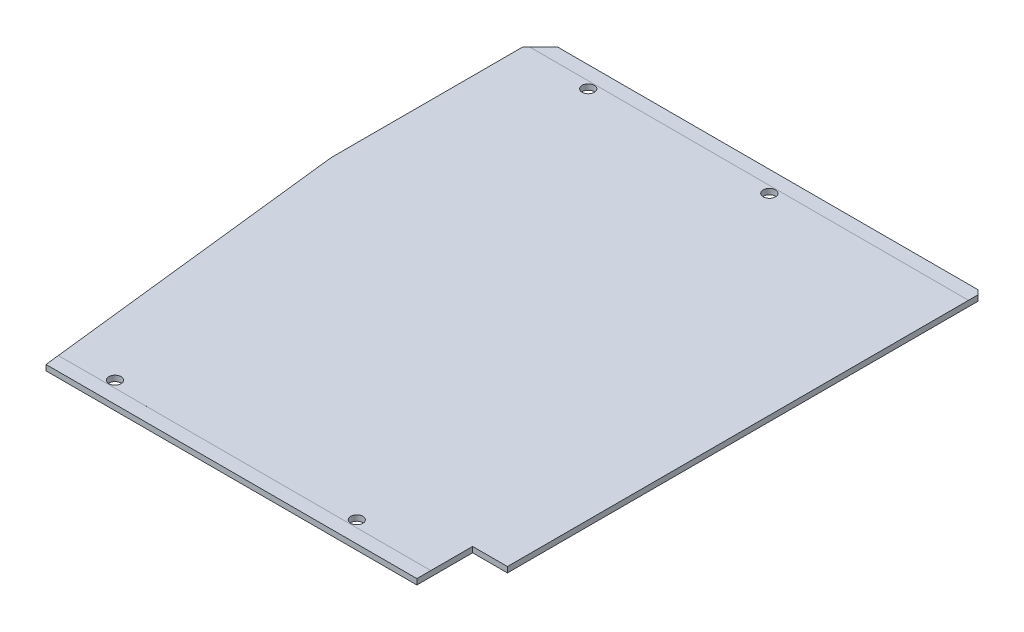
ISO-10303-21;
HEADER;
FILE_DESCRIPTION(('STEP AP214'),'2;1');
FILE_NAME('part.step','',(''),(''),'','','');
FILE_SCHEMA(('AUTOMOTIVE_DESIGN { 1 0 10303 214 1 1 1 1 }'));
ENDSEC;
DATA;
#1=APPLICATION_CONTEXT('core data for automotive mechanical design processes');
#2=APPLICATION_PROTOCOL_DEFINITION('international standard','automotive_design',2000,#1);
#3=PRODUCT_CONTEXT('',#1,'mechanical');
#4=PRODUCT('Part','Part','',(#3));
#5=PRODUCT_RELATED_PRODUCT_CATEGORY('part','',(#4));
#6=PRODUCT_DEFINITION_FORMATION('','',#4);
#7=PRODUCT_DEFINITION_CONTEXT('part definition',#1,'design');
#8=PRODUCT_DEFINITION('design','',#6,#7);
#9=PRODUCT_DEFINITION_SHAPE('','',#8);
#10=(LENGTH_UNIT() NAMED_UNIT(*) SI_UNIT(.MILLI.,.METRE.));
#11=(NAMED_UNIT(*) PLANE_ANGLE_UNIT() SI_UNIT($,.RADIAN.));
#12=(NAMED_UNIT(*) SI_UNIT($,.STERADIAN.) SOLID_ANGLE_UNIT());
#13=UNCERTAINTY_MEASURE_WITH_UNIT(LENGTH_MEASURE(1.E-05),#10,'distance_accuracy_value','');
#14=(GEOMETRIC_REPRESENTATION_CONTEXT(3) GLOBAL_UNCERTAINTY_ASSIGNED_CONTEXT((#13)) GLOBAL_UNIT_ASSIGNED_CONTEXT((#10,
#11,#12)) REPRESENTATION_CONTEXT('',''));
#15=CARTESIAN_POINT('',(0.,0.,0.));
#16=DIRECTION('',(0.,0.,1.));
#17=DIRECTION('',(1.,0.,0.));
#18=AXIS2_PLACEMENT_3D('',#15,#16,#17);
#19=CARTESIAN_POINT('',(-63.5,1.6,76.2));
#20=DIRECTION('',(0.,0.,-1.));
#21=DIRECTION('',(-1.,0.,0.));
#22=AXIS2_PLACEMENT_3D('',#19,#20,#21);
#23=PLANE('',#22);
#24=DIRECTION('',(1.,0.,0.));
#25=VECTOR('',#24,1.);
#26=CARTESIAN_POINT('',(-63.5,0.,76.2));
#27=LINE('',#26,#25);
#28=CARTESIAN_POINT('',(-53.,0.,76.2));
#29=VERTEX_POINT('',#28);
#30=CARTESIAN_POINT('',(53.5,0.,76.2));
#31=VERTEX_POINT('',#30);
#32=EDGE_CURVE('E148',#29,#31,#27,.T.);
#33=ORIENTED_EDGE('',*,*,#32,.T.);
#34=DIRECTION('',(0.,1.,0.));
#35=VECTOR('',#34,1.);
#36=CARTESIAN_POINT('',(53.5,-8.4,76.2));
#37=LINE('',#36,#35);
#38=CARTESIAN_POINT('',(53.5,1.5999,76.2));
#39=VERTEX_POINT('',#38);
#40=EDGE_CURVE('E133',#31,#39,#37,.T.);
#41=ORIENTED_EDGE('',*,*,#40,.T.);
#42=DIRECTION('',(1.,0.,0.));
#43=VECTOR('',#42,1.);
#44=CARTESIAN_POINT('',(-63.5,1.5999,76.2));
#45=LINE('',#44,#43);
#46=CARTESIAN_POINT('',(-53.,1.5999,76.2));
#47=VERTEX_POINT('',#46);
#48=EDGE_CURVE('E194',#47,#39,#45,.T.);
#49=ORIENTED_EDGE('',*,*,#48,.F.);
#50=DIRECTION('',(0.,-1.,0.));
#51=VECTOR('',#50,1.);
#52=CARTESIAN_POINT('',(-53.,249.583617394151,76.2));
#53=LINE('',#52,#51);
#54=EDGE_CURVE('E54',#47,#29,#53,.T.);
#55=ORIENTED_EDGE('',*,*,#54,.T.);
#56=EDGE_LOOP('',(#33,#41,#49,#55));
#57=FACE_BOUND('',#56,.T.);
#58=ADVANCED_FACE('F31',(#57),#23,.F.);
#59=CARTESIAN_POINT('',(63.5,1.6,76.2));
#60=DIRECTION('',(0.,1.,0.));
#61=DIRECTION('',(0.,0.,1.));
#62=AXIS2_PLACEMENT_3D('',#59,#60,#61);
#63=PLANE('',#62);
#64=CARTESIAN_POINT('',(-39.188,1.6,70.2));
#65=DIRECTION('',(0.,1.,0.));
#66=DIRECTION('',(0.,0.,1.));
#67=AXIS2_PLACEMENT_3D('',#64,#65,#66);
#68=CIRCLE('',#67,1.75);
#69=CARTESIAN_POINT('',(-39.188,1.6,71.95));
#70=VERTEX_POINT('',#69);
#71=EDGE_CURVE('E257',#70,#70,#68,.T.);
#72=ORIENTED_EDGE('',*,*,#71,.F.);
#73=EDGE_LOOP('',(#72));
#74=FACE_BOUND('',#73,.T.);
#75=CARTESIAN_POINT('',(30.252,1.6,70.2));
#76=DIRECTION('',(0.,1.,0.));
#77=DIRECTION('',(0.,0.,1.));
#78=AXIS2_PLACEMENT_3D('',#75,#76,#77);
#79=CIRCLE('',#78,1.75);
#80=CARTESIAN_POINT('',(30.252,1.6,71.95));
#81=VERTEX_POINT('',#80);
#82=EDGE_CURVE('E251',#81,#81,#79,.T.);
#83=ORIENTED_EDGE('',*,*,#82,.F.);
#84=EDGE_LOOP('',(#83));
#85=FACE_BOUND('',#84,.T.);
#86=CARTESIAN_POINT('',(8.29999999999998,1.6,-70.2));
#87=DIRECTION('',(0.,1.,0.));
#88=DIRECTION('',(0.,0.,1.));
#89=AXIS2_PLACEMENT_3D('',#86,#87,#88);
#90=CIRCLE('',#89,1.75);
#91=CARTESIAN_POINT('',(8.29999999999998,1.6,-68.45));
#92=VERTEX_POINT('',#91);
#93=EDGE_CURVE('E245',#92,#92,#90,.T.);
#94=ORIENTED_EDGE('',*,*,#93,.F.);
#95=EDGE_LOOP('',(#94));
#96=FACE_BOUND('',#95,.T.);
#97=CARTESIAN_POINT('',(-43.7,1.6,-70.2));
#98=DIRECTION('',(0.,1.,0.));
#99=DIRECTION('',(0.,0.,1.));
#100=AXIS2_PLACEMENT_3D('',#97,#98,#99);
#101=CIRCLE('',#100,1.75);
#102=CARTESIAN_POINT('',(-43.7,1.6,-68.45));
#103=VERTEX_POINT('',#102);
#104=EDGE_CURVE('E239',#103,#103,#101,.T.);
#105=ORIENTED_EDGE('',*,*,#104,.F.);
#106=EDGE_LOOP('',(#105));
#107=FACE_BOUND('',#106,.T.);
#108=DIRECTION('',(0.,0.,1.));
#109=VECTOR('',#108,1.);
#110=CARTESIAN_POINT('',(53.5,1.6,76.2));
#111=LINE('',#110,#109);
#112=CARTESIAN_POINT('',(53.5,1.6,60.2));
#113=VERTEX_POINT('',#112);
#114=CARTESIAN_POINT('',(53.5,1.6,72.2));
#115=VERTEX_POINT('',#114);
#116=EDGE_CURVE('E141',#113,#115,#111,.T.);
#117=ORIENTED_EDGE('',*,*,#116,.F.);
#118=DIRECTION('',(-1.,0.,0.));
#119=VECTOR('',#118,1.);
#120=CARTESIAN_POINT('',(53.5,1.6,60.2));
#121=LINE('',#120,#119);
#122=CARTESIAN_POINT('',(63.5,1.6,60.2));
#123=VERTEX_POINT('',#122);
#124=EDGE_CURVE('E127',#123,#113,#121,.T.);
#125=ORIENTED_EDGE('',*,*,#124,.F.);
#126=DIRECTION('',(0.,0.,-1.));
#127=VECTOR('',#126,1.);
#128=CARTESIAN_POINT('',(63.5,1.6,-76.2));
#129=LINE('',#128,#127);
#130=CARTESIAN_POINT('',(63.5,1.6,-72.2));
#131=VERTEX_POINT('',#130);
#132=EDGE_CURVE('E138',#123,#131,#129,.T.);
#133=ORIENTED_EDGE('',*,*,#132,.T.);
#134=DIRECTION('',(-1.,0.,0.));
#135=VECTOR('',#134,1.);
#136=CARTESIAN_POINT('',(72.4805203195643,1.6,-72.2));
#137=LINE('',#136,#135);
#138=CARTESIAN_POINT('',(-62.5,1.6,-72.2));
#139=VERTEX_POINT('',#138);
#140=EDGE_CURVE('E212',#131,#139,#137,.T.);
#141=ORIENTED_EDGE('',*,*,#140,.T.);
#142=DIRECTION('',(0.707106781186548,0.,-0.707106781186548));
#143=VECTOR('',#142,1.);
#144=CARTESIAN_POINT('',(-73.7,1.6,-61.));
#145=LINE('',#144,#143);
#146=CARTESIAN_POINT('',(-63.5,1.6,-71.2));
#147=VERTEX_POINT('',#146);
#148=EDGE_CURVE('E173',#139,#147,#145,.F.);
#149=ORIENTED_EDGE('',*,*,#148,.T.);
#150=DIRECTION('',(0.,0.,1.));
#151=VECTOR('',#150,1.);
#152=CARTESIAN_POINT('',(-63.5,1.6,-76.2));
#153=LINE('',#152,#151);
#154=CARTESIAN_POINT('',(-63.5,1.59999999999999,-16.2));
#155=VERTEX_POINT('',#154);
#156=EDGE_CURVE('E147',#147,#155,#153,.T.);
#157=ORIENTED_EDGE('',*,*,#156,.T.);
#158=DIRECTION('',(0.112909688044286,0.,0.993605254789719));
#159=VECTOR('',#158,1.);
#160=CARTESIAN_POINT('',(-51.514788373279,1.6,89.2698623151453));
#161=LINE('',#160,#159);
#162=CARTESIAN_POINT('',(-53.4545454545454,1.6,72.2));
#163=VERTEX_POINT('',#162);
#164=EDGE_CURVE('E219',#155,#163,#161,.T.);
#165=ORIENTED_EDGE('',*,*,#164,.T.);
#166=DIRECTION('',(1.,0.,0.));
#167=VECTOR('',#166,1.);
#168=CARTESIAN_POINT('',(72.4805203195644,1.6,72.2));
#169=LINE('',#168,#167);
#170=EDGE_CURVE('E209',#163,#115,#169,.T.);
#171=ORIENTED_EDGE('',*,*,#170,.T.);
#172=EDGE_LOOP('',(#117,#125,#133,#141,#149,#157,#165,#171));
#173=FACE_BOUND('',#172,.T.);
#174=ADVANCED_FACE('F136',(#74,#85,#96,#107,#173),#63,.T.);
#175=CARTESIAN_POINT('',(-63.5,1.6,-76.2));
#176=DIRECTION('',(1.,0.,0.));
#177=DIRECTION('',(0.,0.,-1.));
#178=AXIS2_PLACEMENT_3D('',#175,#176,#177);
#179=PLANE('',#178);
#180=DIRECTION('',(0.,-1.,0.));
#181=VECTOR('',#180,1.);
#182=CARTESIAN_POINT('',(-63.5,249.583617394151,-16.2));
#183=LINE('',#182,#181);
#184=CARTESIAN_POINT('',(-63.5,0.,-16.2));
#185=VERTEX_POINT('',#184);
#186=EDGE_CURVE('E224',#155,#185,#183,.T.);
#187=ORIENTED_EDGE('',*,*,#186,.F.);
#188=ORIENTED_EDGE('',*,*,#156,.F.);
#189=DIRECTION('',(0.,-1.,0.));
#190=VECTOR('',#189,1.);
#191=CARTESIAN_POINT('',(-63.5,1.6,-71.2));
#192=LINE('',#191,#190);
#193=CARTESIAN_POINT('',(-63.5,0.,-71.2));
#194=VERTEX_POINT('',#193);
#195=EDGE_CURVE('E151',#147,#194,#192,.T.);
#196=ORIENTED_EDGE('',*,*,#195,.T.);
#197=DIRECTION('',(0.,0.,1.));
#198=VECTOR('',#197,1.);
#199=CARTESIAN_POINT('',(-63.5,0.,-76.2));
#200=LINE('',#199,#198);
#201=EDGE_CURVE('E154',#194,#185,#200,.T.);
#202=ORIENTED_EDGE('',*,*,#201,.T.);
#203=EDGE_LOOP('',(#187,#188,#196,#202));
#204=FACE_BOUND('',#203,.T.);
#205=ADVANCED_FACE('F266',(#204),#179,.F.);
#206=CARTESIAN_POINT('',(63.5,0.,76.2));
#207=DIRECTION('',(0.,1.,0.));
#208=DIRECTION('',(0.,0.,1.));
#209=AXIS2_PLACEMENT_3D('',#206,#207,#208);
#210=PLANE('',#209);
#211=CARTESIAN_POINT('',(-39.188,0.,70.2));
#212=DIRECTION('',(0.,1.,0.));
#213=DIRECTION('',(0.,0.,1.));
#214=AXIS2_PLACEMENT_3D('',#211,#212,#213);
#215=CIRCLE('',#214,1.75);
#216=CARTESIAN_POINT('',(-39.188,0.,71.95));
#217=VERTEX_POINT('',#216);
#218=EDGE_CURVE('E254',#217,#217,#215,.F.);
#219=ORIENTED_EDGE('',*,*,#218,.F.);
#220=EDGE_LOOP('',(#219));
#221=FACE_BOUND('',#220,.T.);
#222=CARTESIAN_POINT('',(30.252,0.,70.2));
#223=DIRECTION('',(0.,1.,0.));
#224=DIRECTION('',(0.,0.,1.));
#225=AXIS2_PLACEMENT_3D('',#222,#223,#224);
#226=CIRCLE('',#225,1.75);
#227=CARTESIAN_POINT('',(30.252,0.,71.95));
#228=VERTEX_POINT('',#227);
#229=EDGE_CURVE('E248',#228,#228,#226,.F.);
#230=ORIENTED_EDGE('',*,*,#229,.F.);
#231=EDGE_LOOP('',(#230));
#232=FACE_BOUND('',#231,.T.);
#233=CARTESIAN_POINT('',(8.29999999999998,0.,-70.2));
#234=DIRECTION('',(0.,1.,0.));
#235=DIRECTION('',(0.,0.,1.));
#236=AXIS2_PLACEMENT_3D('',#233,#234,#235);
#237=CIRCLE('',#236,1.75);
#238=CARTESIAN_POINT('',(8.29999999999998,0.,-68.45));
#239=VERTEX_POINT('',#238);
#240=EDGE_CURVE('E242',#239,#239,#237,.F.);
#241=ORIENTED_EDGE('',*,*,#240,.F.);
#242=EDGE_LOOP('',(#241));
#243=FACE_BOUND('',#242,.T.);
#244=CARTESIAN_POINT('',(-43.7,0.,-70.2));
#245=DIRECTION('',(0.,1.,0.));
#246=DIRECTION('',(0.,0.,1.));
#247=AXIS2_PLACEMENT_3D('',#244,#245,#246);
#248=CIRCLE('',#247,1.75);
#249=CARTESIAN_POINT('',(-43.7,0.,-68.45));
#250=VERTEX_POINT('',#249);
#251=EDGE_CURVE('E236',#250,#250,#248,.F.);
#252=ORIENTED_EDGE('',*,*,#251,.F.);
#253=EDGE_LOOP('',(#252));
#254=FACE_BOUND('',#253,.T.);
#255=DIRECTION('',(-1.,0.,0.));
#256=VECTOR('',#255,1.);
#257=CARTESIAN_POINT('',(63.5,0.,60.2));
#258=LINE('',#257,#256);
#259=CARTESIAN_POINT('',(63.5,0.,60.2));
#260=VERTEX_POINT('',#259);
#261=CARTESIAN_POINT('',(53.5,0.,60.2));
#262=VERTEX_POINT('',#261);
#263=EDGE_CURVE('E46',#260,#262,#258,.T.);
#264=ORIENTED_EDGE('',*,*,#263,.T.);
#265=DIRECTION('',(0.,0.,1.));
#266=VECTOR('',#265,1.);
#267=CARTESIAN_POINT('',(53.5,0.,76.2));
#268=LINE('',#267,#266);
#269=EDGE_CURVE('E226',#262,#31,#268,.T.);
#270=ORIENTED_EDGE('',*,*,#269,.T.);
#271=ORIENTED_EDGE('',*,*,#32,.F.);
#272=DIRECTION('',(0.112909688044286,0.,0.993605254789719));
#273=VECTOR('',#272,1.);
#274=CARTESIAN_POINT('',(-51.514788373279,0.,89.2698623151453));
#275=LINE('',#274,#273);
#276=EDGE_CURVE('E214',#185,#29,#275,.T.);
#277=ORIENTED_EDGE('',*,*,#276,.F.);
#278=ORIENTED_EDGE('',*,*,#201,.F.);
#279=DIRECTION('',(-0.707106781186548,0.,0.707106781186548));
#280=VECTOR('',#279,1.);
#281=CARTESIAN_POINT('',(-63.5,0.,-71.2));
#282=LINE('',#281,#280);
#283=CARTESIAN_POINT('',(-58.5,0.,-76.2));
#284=VERTEX_POINT('',#283);
#285=EDGE_CURVE('E167',#194,#284,#282,.F.);
#286=ORIENTED_EDGE('',*,*,#285,.T.);
#287=DIRECTION('',(-1.,0.,0.));
#288=VECTOR('',#287,1.);
#289=CARTESIAN_POINT('',(-63.5,0.,-76.2));
#290=LINE('',#289,#288);
#291=CARTESIAN_POINT('',(62.23,0.,-76.2));
#292=VERTEX_POINT('',#291);
#293=EDGE_CURVE('E161',#292,#284,#290,.T.);
#294=ORIENTED_EDGE('',*,*,#293,.F.);
#295=DIRECTION('',(-0.70710678118654,0.,-0.707106781186555));
#296=VECTOR('',#295,1.);
#297=CARTESIAN_POINT('',(62.23,0.,-76.2));
#298=LINE('',#297,#296);
#299=CARTESIAN_POINT('',(63.5,0.,-74.93));
#300=VERTEX_POINT('',#299);
#301=EDGE_CURVE('E178',#292,#300,#298,.F.);
#302=ORIENTED_EDGE('',*,*,#301,.T.);
#303=DIRECTION('',(0.,0.,-1.));
#304=VECTOR('',#303,1.);
#305=CARTESIAN_POINT('',(63.5,0.,-76.2));
#306=LINE('',#305,#304);
#307=EDGE_CURVE('E159',#260,#300,#306,.T.);
#308=ORIENTED_EDGE('',*,*,#307,.F.);
#309=EDGE_LOOP('',(#264,#270,#271,#277,#278,#286,#294,#302,#308));
#310=FACE_BOUND('',#309,.T.);
#311=ADVANCED_FACE('F281',(#221,#232,#243,#254,#310),#210,.F.);
#312=CARTESIAN_POINT('',(72.4805203195644,1.5999,72.2));
#313=DIRECTION('',(0.,0.,1.));
#314=DIRECTION('',(1.,0.,0.));
#315=AXIS2_PLACEMENT_3D('',#312,#313,#314);
#316=PLANE('',#315);
#317=DIRECTION('',(0.,-1.,0.));
#318=VECTOR('',#317,1.);
#319=CARTESIAN_POINT('',(53.5,1.5999,72.2));
#320=LINE('',#319,#318);
#321=CARTESIAN_POINT('',(53.5,1.5999,72.2));
#322=VERTEX_POINT('',#321);
#323=EDGE_CURVE('E230',#115,#322,#320,.T.);
#324=ORIENTED_EDGE('',*,*,#323,.F.);
#325=ORIENTED_EDGE('',*,*,#170,.F.);
#326=DIRECTION('',(0.,-1.,0.));
#327=VECTOR('',#326,1.);
#328=CARTESIAN_POINT('',(-53.4545454545454,1.5999,72.2));
#329=LINE('',#328,#327);
#330=CARTESIAN_POINT('',(-53.4545454545455,1.5999,72.2));
#331=VERTEX_POINT('',#330);
#332=EDGE_CURVE('E222',#163,#331,#329,.T.);
#333=ORIENTED_EDGE('',*,*,#332,.T.);
#334=DIRECTION('',(1.,0.,0.));
#335=VECTOR('',#334,1.);
#336=CARTESIAN_POINT('',(72.4805203195644,1.5999,72.2));
#337=LINE('',#336,#335);
#338=EDGE_CURVE('E196',#331,#322,#337,.T.);
#339=ORIENTED_EDGE('',*,*,#338,.T.);
#340=EDGE_LOOP('',(#324,#325,#333,#339));
#341=FACE_BOUND('',#340,.T.);
#342=ADVANCED_FACE('F284',(#341),#316,.T.);
#343=CARTESIAN_POINT('',(-0.842207065483019,1.5999,0.));
#344=DIRECTION('',(0.,1.,0.));
#345=DIRECTION('',(0.,0.,1.));
#346=AXIS2_PLACEMENT_3D('',#343,#344,#345);
#347=PLANE('',#346);
#348=DIRECTION('',(0.,0.,1.));
#349=VECTOR('',#348,1.);
#350=CARTESIAN_POINT('',(53.5,1.5999,0.));
#351=LINE('',#350,#349);
#352=EDGE_CURVE('E12',#322,#39,#351,.T.);
#353=ORIENTED_EDGE('',*,*,#352,.F.);
#354=ORIENTED_EDGE('',*,*,#338,.F.);
#355=DIRECTION('',(0.112909688044286,0.,0.993605254789719));
#356=VECTOR('',#355,1.);
#357=CARTESIAN_POINT('',(-60.883760926383,1.5999,6.82290384782955));
#358=LINE('',#357,#356);
#359=EDGE_CURVE('E39',#331,#47,#358,.T.);
#360=ORIENTED_EDGE('',*,*,#359,.T.);
#361=ORIENTED_EDGE('',*,*,#48,.T.);
#362=EDGE_LOOP('',(#353,#354,#360,#361));
#363=FACE_BOUND('',#362,.T.);
#364=ADVANCED_FACE('F193',(#363),#347,.T.);
#365=CARTESIAN_POINT('',(63.5,1.6,-76.2));
#366=DIRECTION('',(-1.,0.,0.));
#367=DIRECTION('',(0.,0.,1.));
#368=AXIS2_PLACEMENT_3D('',#365,#366,#367);
#369=PLANE('',#368);
#370=ORIENTED_EDGE('',*,*,#132,.F.);
#371=DIRECTION('',(0.,1.,0.));
#372=VECTOR('',#371,1.);
#373=CARTESIAN_POINT('',(63.5,-8.4,60.2));
#374=LINE('',#373,#372);
#375=EDGE_CURVE('E124',#260,#123,#374,.T.);
#376=ORIENTED_EDGE('',*,*,#375,.F.);
#377=ORIENTED_EDGE('',*,*,#307,.T.);
#378=DIRECTION('',(0.,1.,0.));
#379=VECTOR('',#378,1.);
#380=CARTESIAN_POINT('',(63.5,1.6,-74.93));
#381=LINE('',#380,#379);
#382=CARTESIAN_POINT('',(63.5,1.5999,-74.93));
#383=VERTEX_POINT('',#382);
#384=EDGE_CURVE('E175',#300,#383,#381,.T.);
#385=ORIENTED_EDGE('',*,*,#384,.T.);
#386=DIRECTION('',(0.,0.,-1.));
#387=VECTOR('',#386,1.);
#388=CARTESIAN_POINT('',(63.5,1.5999,-76.2));
#389=LINE('',#388,#387);
#390=CARTESIAN_POINT('',(63.5,1.5999,-72.2));
#391=VERTEX_POINT('',#390);
#392=EDGE_CURVE('E203',#391,#383,#389,.T.);
#393=ORIENTED_EDGE('',*,*,#392,.F.);
#394=DIRECTION('',(0.,-1.,0.));
#395=VECTOR('',#394,1.);
#396=CARTESIAN_POINT('',(63.5,1.6,-72.2));
#397=LINE('',#396,#395);
#398=EDGE_CURVE('E146',#131,#391,#397,.T.);
#399=ORIENTED_EDGE('',*,*,#398,.F.);
#400=EDGE_LOOP('',(#370,#376,#377,#385,#393,#399));
#401=FACE_BOUND('',#400,.T.);
#402=ADVANCED_FACE('F144',(#401),#369,.F.);
#403=CARTESIAN_POINT('',(-63.5,1.6,-76.2));
#404=DIRECTION('',(0.,0.,1.));
#405=DIRECTION('',(1.,0.,0.));
#406=AXIS2_PLACEMENT_3D('',#403,#404,#405);
#407=PLANE('',#406);
#408=DIRECTION('',(-1.,0.,0.));
#409=VECTOR('',#408,1.);
#410=CARTESIAN_POINT('',(-63.5,1.5999,-76.2));
#411=LINE('',#410,#409);
#412=CARTESIAN_POINT('',(62.23,1.5999,-76.2));
#413=VERTEX_POINT('',#412);
#414=CARTESIAN_POINT('',(-58.5,1.5999,-76.2));
#415=VERTEX_POINT('',#414);
#416=EDGE_CURVE('E207',#413,#415,#411,.T.);
#417=ORIENTED_EDGE('',*,*,#416,.F.);
#418=DIRECTION('',(0.,-1.,0.));
#419=VECTOR('',#418,1.);
#420=CARTESIAN_POINT('',(62.23,1.6,-76.2));
#421=LINE('',#420,#419);
#422=EDGE_CURVE('E181',#413,#292,#421,.T.);
#423=ORIENTED_EDGE('',*,*,#422,.T.);
#424=ORIENTED_EDGE('',*,*,#293,.T.);
#425=DIRECTION('',(0.,1.,0.));
#426=VECTOR('',#425,1.);
#427=CARTESIAN_POINT('',(-58.5,1.6,-76.2));
#428=LINE('',#427,#426);
#429=EDGE_CURVE('E170',#284,#415,#428,.T.);
#430=ORIENTED_EDGE('',*,*,#429,.T.);
#431=EDGE_LOOP('',(#417,#423,#424,#430));
#432=FACE_BOUND('',#431,.T.);
#433=ADVANCED_FACE('F297',(#432),#407,.F.);
#434=CARTESIAN_POINT('',(-63.5,1.6,-71.2));
#435=DIRECTION('',(0.707106781186548,0.,0.707106781186548));
#436=DIRECTION('',(0.707106781186548,0.,-0.707106781186548));
#437=AXIS2_PLACEMENT_3D('',#434,#435,#436);
#438=PLANE('',#437);
#439=DIRECTION('',(0.,1.,0.));
#440=VECTOR('',#439,1.);
#441=CARTESIAN_POINT('',(-62.5,1.6,-72.2));
#442=LINE('',#441,#440);
#443=CARTESIAN_POINT('',(-62.5,1.5999,-72.2));
#444=VERTEX_POINT('',#443);
#445=EDGE_CURVE('E186',#139,#444,#442,.F.);
#446=ORIENTED_EDGE('',*,*,#445,.T.);
#447=DIRECTION('',(-0.707106781186548,0.,0.707106781186548));
#448=VECTOR('',#447,1.);
#449=CARTESIAN_POINT('',(-63.5,1.5999,-71.2));
#450=LINE('',#449,#448);
#451=EDGE_CURVE('E201',#444,#415,#450,.F.);
#452=ORIENTED_EDGE('',*,*,#451,.T.);
#453=ORIENTED_EDGE('',*,*,#429,.F.);
#454=ORIENTED_EDGE('',*,*,#285,.F.);
#455=ORIENTED_EDGE('',*,*,#195,.F.);
#456=ORIENTED_EDGE('',*,*,#148,.F.);
#457=EDGE_LOOP('',(#446,#452,#453,#454,#455,#456));
#458=FACE_BOUND('',#457,.T.);
#459=ADVANCED_FACE('F300',(#458),#438,.F.);
#460=CARTESIAN_POINT('',(62.23,1.6,-76.2));
#461=DIRECTION('',(-0.707106781186555,0.,0.70710678118654));
#462=DIRECTION('',(0.70710678118654,0.,0.707106781186555));
#463=AXIS2_PLACEMENT_3D('',#460,#461,#462);
#464=PLANE('',#463);
#465=ORIENTED_EDGE('',*,*,#422,.F.);
#466=DIRECTION('',(-0.70710678118654,0.,-0.707106781186555));
#467=VECTOR('',#466,1.);
#468=CARTESIAN_POINT('',(62.23,1.5999,-76.2));
#469=LINE('',#468,#467);
#470=EDGE_CURVE('E183',#413,#383,#469,.F.);
#471=ORIENTED_EDGE('',*,*,#470,.T.);
#472=ORIENTED_EDGE('',*,*,#384,.F.);
#473=ORIENTED_EDGE('',*,*,#301,.F.);
#474=EDGE_LOOP('',(#465,#471,#472,#473));
#475=FACE_BOUND('',#474,.T.);
#476=ADVANCED_FACE('F33',(#475),#464,.F.);
#477=DIRECTION('',(-1.,0.,0.));
#478=VECTOR('',#477,1.);
#479=CARTESIAN_POINT('',(72.4805203195643,1.5999,-72.2));
#480=LINE('',#479,#478);
#481=EDGE_CURVE('E211',#391,#444,#480,.T.);
#482=ORIENTED_EDGE('',*,*,#481,.F.);
#483=ORIENTED_EDGE('',*,*,#392,.T.);
#484=ORIENTED_EDGE('',*,*,#470,.F.);
#485=ORIENTED_EDGE('',*,*,#416,.T.);
#486=ORIENTED_EDGE('',*,*,#451,.F.);
#487=EDGE_LOOP('',(#482,#483,#484,#485,#486));
#488=FACE_BOUND('',#487,.T.);
#489=ADVANCED_FACE('F295',(#488),#347,.T.);
#490=CARTESIAN_POINT('',(72.4805203195643,1.5999,-72.2));
#491=DIRECTION('',(0.,0.,-1.));
#492=DIRECTION('',(-1.,0.,0.));
#493=AXIS2_PLACEMENT_3D('',#490,#491,#492);
#494=PLANE('',#493);
#495=ORIENTED_EDGE('',*,*,#398,.T.);
#496=ORIENTED_EDGE('',*,*,#481,.T.);
#497=ORIENTED_EDGE('',*,*,#445,.F.);
#498=ORIENTED_EDGE('',*,*,#140,.F.);
#499=EDGE_LOOP('',(#495,#496,#497,#498));
#500=FACE_BOUND('',#499,.T.);
#501=ADVANCED_FACE('F304',(#500),#494,.T.);
#502=CARTESIAN_POINT('',(-53.,249.583617394151,76.2));
#503=DIRECTION('',(-0.993605254789719,0.,0.112909688044286));
#504=DIRECTION('',(0.112909688044286,0.,0.993605254789719));
#505=AXIS2_PLACEMENT_3D('',#502,#503,#504);
#506=PLANE('',#505);
#507=ORIENTED_EDGE('',*,*,#186,.T.);
#508=ORIENTED_EDGE('',*,*,#276,.T.);
#509=ORIENTED_EDGE('',*,*,#54,.F.);
#510=ORIENTED_EDGE('',*,*,#359,.F.);
#511=ORIENTED_EDGE('',*,*,#332,.F.);
#512=ORIENTED_EDGE('',*,*,#164,.F.);
#513=EDGE_LOOP('',(#507,#508,#509,#510,#511,#512));
#514=FACE_BOUND('',#513,.T.);
#515=ADVANCED_FACE('F310',(#514),#506,.T.);
#516=CARTESIAN_POINT('',(53.5,-8.4,76.2));
#517=DIRECTION('',(-1.,0.,0.));
#518=DIRECTION('',(0.,0.,1.));
#519=AXIS2_PLACEMENT_3D('',#516,#517,#518);
#520=PLANE('',#519);
#521=DIRECTION('',(0.,1.,0.));
#522=VECTOR('',#521,1.);
#523=CARTESIAN_POINT('',(53.5,-8.4,60.2));
#524=LINE('',#523,#522);
#525=EDGE_CURVE('E132',#262,#113,#524,.T.);
#526=ORIENTED_EDGE('',*,*,#525,.T.);
#527=ORIENTED_EDGE('',*,*,#116,.T.);
#528=ORIENTED_EDGE('',*,*,#323,.T.);
#529=ORIENTED_EDGE('',*,*,#352,.T.);
#530=ORIENTED_EDGE('',*,*,#40,.F.);
#531=ORIENTED_EDGE('',*,*,#269,.F.);
#532=EDGE_LOOP('',(#526,#527,#528,#529,#530,#531));
#533=FACE_BOUND('',#532,.T.);
#534=ADVANCED_FACE('F315',(#533),#520,.F.);
#535=CARTESIAN_POINT('',(53.5,-8.4,60.2));
#536=DIRECTION('',(0.,0.,-1.));
#537=DIRECTION('',(-1.,0.,0.));
#538=AXIS2_PLACEMENT_3D('',#535,#536,#537);
#539=PLANE('',#538);
#540=ORIENTED_EDGE('',*,*,#375,.T.);
#541=ORIENTED_EDGE('',*,*,#124,.T.);
#542=ORIENTED_EDGE('',*,*,#525,.F.);
#543=ORIENTED_EDGE('',*,*,#263,.F.);
#544=EDGE_LOOP('',(#540,#541,#542,#543));
#545=FACE_BOUND('',#544,.T.);
#546=ADVANCED_FACE('F126',(#545),#539,.F.);
#547=CARTESIAN_POINT('',(-43.7,-0.000999999999999916,-70.2));
#548=DIRECTION('',(0.,1.,0.));
#549=DIRECTION('',(0.,0.,1.));
#550=AXIS2_PLACEMENT_3D('',#547,#548,#549);
#551=CYLINDRICAL_SURFACE('',#550,1.75);
#552=ORIENTED_EDGE('',*,*,#104,.T.);
#553=EDGE_LOOP('',(#552));
#554=FACE_BOUND('',#553,.T.);
#555=ORIENTED_EDGE('',*,*,#251,.T.);
#556=EDGE_LOOP('',(#555));
#557=FACE_BOUND('',#556,.T.);
#558=ADVANCED_FACE('F274',(#554,#557),#551,.F.);
#559=CARTESIAN_POINT('',(8.29999999999998,-0.000999999999999916,-70.2));
#560=DIRECTION('',(0.,1.,0.));
#561=DIRECTION('',(0.,0.,1.));
#562=AXIS2_PLACEMENT_3D('',#559,#560,#561);
#563=CYLINDRICAL_SURFACE('',#562,1.75);
#564=ORIENTED_EDGE('',*,*,#93,.T.);
#565=EDGE_LOOP('',(#564));
#566=FACE_BOUND('',#565,.T.);
#567=ORIENTED_EDGE('',*,*,#240,.T.);
#568=EDGE_LOOP('',(#567));
#569=FACE_BOUND('',#568,.T.);
#570=ADVANCED_FACE('F277',(#566,#569),#563,.F.);
#571=CARTESIAN_POINT('',(30.252,-0.000999999999999916,70.2));
#572=DIRECTION('',(0.,1.,0.));
#573=DIRECTION('',(0.,0.,1.));
#574=AXIS2_PLACEMENT_3D('',#571,#572,#573);
#575=CYLINDRICAL_SURFACE('',#574,1.75);
#576=ORIENTED_EDGE('',*,*,#82,.T.);
#577=EDGE_LOOP('',(#576));
#578=FACE_BOUND('',#577,.T.);
#579=ORIENTED_EDGE('',*,*,#229,.T.);
#580=EDGE_LOOP('',(#579));
#581=FACE_BOUND('',#580,.T.);
#582=ADVANCED_FACE('F432',(#578,#581),#575,.F.);
#583=CARTESIAN_POINT('',(-39.188,-0.000999999999999916,70.2));
#584=DIRECTION('',(0.,1.,0.));
#585=DIRECTION('',(0.,0.,1.));
#586=AXIS2_PLACEMENT_3D('',#583,#584,#585);
#587=CYLINDRICAL_SURFACE('',#586,1.75);
#588=ORIENTED_EDGE('',*,*,#71,.T.);
#589=EDGE_LOOP('',(#588));
#590=FACE_BOUND('',#589,.T.);
#591=ORIENTED_EDGE('',*,*,#218,.T.);
#592=EDGE_LOOP('',(#591));
#593=FACE_BOUND('',#592,.T.);
#594=ADVANCED_FACE('F261',(#590,#593),#587,.F.);
#595=CLOSED_SHELL('',(#58,#174,#205,#311,#342,#364,#402,#433,#459,#476,#489,#501,#515,#534,#546,
#558,#570,#582,#594));
#596=MANIFOLD_SOLID_BREP('B2',#595);
#597=ADVANCED_BREP_SHAPE_REPRESENTATION('',(#18,#596),#14);
#598=SHAPE_DEFINITION_REPRESENTATION(#9,#597);
ENDSEC;
END-ISO-10303-21;
